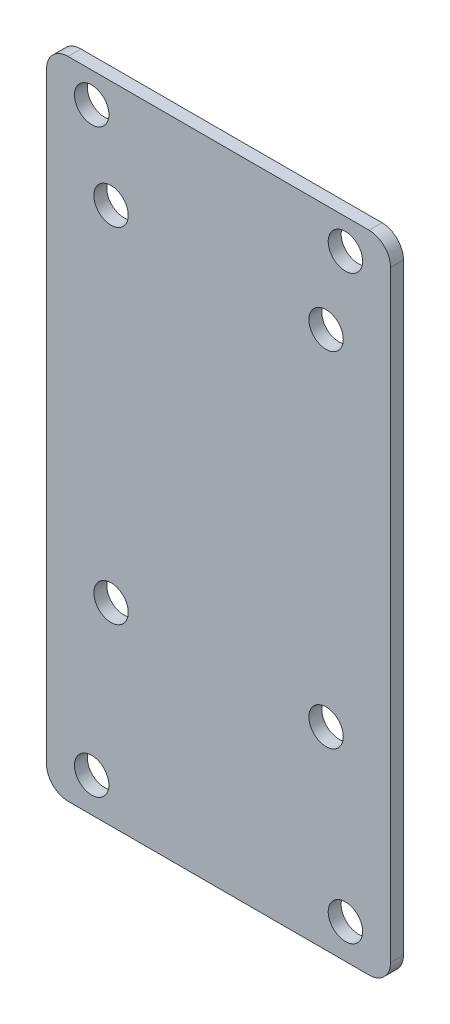
ISO-10303-21;
HEADER;
FILE_DESCRIPTION(('STEP AP214'),'2;1');
FILE_NAME('part.step','',(''),(''),'','','');
FILE_SCHEMA(('AUTOMOTIVE_DESIGN { 1 0 10303 214 1 1 1 1 }'));
ENDSEC;
DATA;
#1=APPLICATION_CONTEXT('core data for automotive mechanical design processes');
#2=APPLICATION_PROTOCOL_DEFINITION('international standard','automotive_design',2000,#1);
#3=PRODUCT_CONTEXT('',#1,'mechanical');
#4=PRODUCT('Part','Part','',(#3));
#5=PRODUCT_RELATED_PRODUCT_CATEGORY('part','',(#4));
#6=PRODUCT_DEFINITION_FORMATION('','',#4);
#7=PRODUCT_DEFINITION_CONTEXT('part definition',#1,'design');
#8=PRODUCT_DEFINITION('design','',#6,#7);
#9=PRODUCT_DEFINITION_SHAPE('','',#8);
#10=(LENGTH_UNIT() NAMED_UNIT(*) SI_UNIT(.MILLI.,.METRE.));
#11=(NAMED_UNIT(*) PLANE_ANGLE_UNIT() SI_UNIT($,.RADIAN.));
#12=(NAMED_UNIT(*) SI_UNIT($,.STERADIAN.) SOLID_ANGLE_UNIT());
#13=UNCERTAINTY_MEASURE_WITH_UNIT(LENGTH_MEASURE(1.E-05),#10,'distance_accuracy_value','');
#14=(GEOMETRIC_REPRESENTATION_CONTEXT(3) GLOBAL_UNCERTAINTY_ASSIGNED_CONTEXT((#13)) GLOBAL_UNIT_ASSIGNED_CONTEXT((#10,
#11,#12)) REPRESENTATION_CONTEXT('',''));
#15=CARTESIAN_POINT('',(0.,0.,0.));
#16=DIRECTION('',(0.,0.,1.));
#17=DIRECTION('',(1.,0.,0.));
#18=AXIS2_PLACEMENT_3D('',#15,#16,#17);
#19=CARTESIAN_POINT('',(0.,0.,3.));
#20=DIRECTION('',(0.,0.,1.));
#21=DIRECTION('',(1.,0.,0.));
#22=AXIS2_PLACEMENT_3D('',#19,#20,#21);
#23=PLANE('',#22);
#24=CARTESIAN_POINT('',(25.,-30.,3.));
#25=DIRECTION('',(0.,0.,1.));
#26=DIRECTION('',(1.,0.,0.));
#27=AXIS2_PLACEMENT_3D('',#24,#25,#26);
#28=CIRCLE('',#27,3.99999999999999);
#29=CARTESIAN_POINT('',(29.,-30.,3.));
#30=VERTEX_POINT('',#29);
#31=EDGE_CURVE('E210',#30,#30,#28,.T.);
#32=ORIENTED_EDGE('',*,*,#31,.F.);
#33=EDGE_LOOP('',(#32));
#34=FACE_BOUND('',#33,.T.);
#35=CARTESIAN_POINT('',(-25.,50.,3.));
#36=DIRECTION('',(0.,0.,1.));
#37=DIRECTION('',(1.,0.,0.));
#38=AXIS2_PLACEMENT_3D('',#35,#36,#37);
#39=CIRCLE('',#38,4.);
#40=CARTESIAN_POINT('',(-21.,50.,3.));
#41=VERTEX_POINT('',#40);
#42=EDGE_CURVE('E198',#41,#41,#39,.T.);
#43=ORIENTED_EDGE('',*,*,#42,.F.);
#44=EDGE_LOOP('',(#43));
#45=FACE_BOUND('',#44,.T.);
#46=CARTESIAN_POINT('',(29.5,-67.,3.));
#47=DIRECTION('',(0.,0.,1.));
#48=DIRECTION('',(1.,0.,0.));
#49=AXIS2_PLACEMENT_3D('',#46,#47,#48);
#50=CIRCLE('',#49,4.00000000000002);
#51=CARTESIAN_POINT('',(33.5,-67.,3.));
#52=VERTEX_POINT('',#51);
#53=EDGE_CURVE('E186',#52,#52,#50,.T.);
#54=ORIENTED_EDGE('',*,*,#53,.F.);
#55=EDGE_LOOP('',(#54));
#56=FACE_BOUND('',#55,.T.);
#57=CARTESIAN_POINT('',(-29.5,68.,3.));
#58=DIRECTION('',(0.,0.,1.));
#59=DIRECTION('',(1.,0.,0.));
#60=AXIS2_PLACEMENT_3D('',#57,#58,#59);
#61=CIRCLE('',#60,4.);
#62=CARTESIAN_POINT('',(-25.5,68.,3.));
#63=VERTEX_POINT('',#62);
#64=EDGE_CURVE('E128',#63,#63,#61,.T.);
#65=ORIENTED_EDGE('',*,*,#64,.F.);
#66=EDGE_LOOP('',(#65));
#67=FACE_BOUND('',#66,.T.);
#68=DIRECTION('',(1.,0.,0.));
#69=VECTOR('',#68,1.);
#70=CARTESIAN_POINT('',(-40.,-75.,3.));
#71=LINE('',#70,#69);
#72=CARTESIAN_POINT('',(-35.,-75.,3.));
#73=VERTEX_POINT('',#72);
#74=CARTESIAN_POINT('',(35.,-75.,3.));
#75=VERTEX_POINT('',#74);
#76=EDGE_CURVE('E137',#73,#75,#71,.T.);
#77=ORIENTED_EDGE('',*,*,#76,.T.);
#78=CARTESIAN_POINT('',(35.,-70.,3.));
#79=DIRECTION('',(0.,0.,1.));
#80=DIRECTION('',(1.,0.,0.));
#81=AXIS2_PLACEMENT_3D('',#78,#79,#80);
#82=CIRCLE('',#81,5.);
#83=CARTESIAN_POINT('',(40.,-70.,3.));
#84=VERTEX_POINT('',#83);
#85=EDGE_CURVE('E155',#75,#84,#82,.T.);
#86=ORIENTED_EDGE('',*,*,#85,.T.);
#87=DIRECTION('',(0.,1.,0.));
#88=VECTOR('',#87,1.);
#89=CARTESIAN_POINT('',(40.,75.,3.));
#90=LINE('',#89,#88);
#91=CARTESIAN_POINT('',(40.,70.,3.));
#92=VERTEX_POINT('',#91);
#93=EDGE_CURVE('E119',#84,#92,#90,.T.);
#94=ORIENTED_EDGE('',*,*,#93,.T.);
#95=CARTESIAN_POINT('',(35.,70.,3.));
#96=DIRECTION('',(0.,0.,1.));
#97=DIRECTION('',(1.,0.,0.));
#98=AXIS2_PLACEMENT_3D('',#95,#96,#97);
#99=CIRCLE('',#98,5.);
#100=CARTESIAN_POINT('',(35.,75.,3.));
#101=VERTEX_POINT('',#100);
#102=EDGE_CURVE('E152',#92,#101,#99,.T.);
#103=ORIENTED_EDGE('',*,*,#102,.T.);
#104=DIRECTION('',(-1.,0.,0.));
#105=VECTOR('',#104,1.);
#106=CARTESIAN_POINT('',(-40.,75.,3.));
#107=LINE('',#106,#105);
#108=CARTESIAN_POINT('',(-35.,75.,3.));
#109=VERTEX_POINT('',#108);
#110=EDGE_CURVE('E166',#101,#109,#107,.T.);
#111=ORIENTED_EDGE('',*,*,#110,.T.);
#112=CARTESIAN_POINT('',(-35.,70.,3.));
#113=DIRECTION('',(0.,0.,1.));
#114=DIRECTION('',(1.,0.,0.));
#115=AXIS2_PLACEMENT_3D('',#112,#113,#114);
#116=CIRCLE('',#115,5.);
#117=CARTESIAN_POINT('',(-40.,70.,3.));
#118=VERTEX_POINT('',#117);
#119=EDGE_CURVE('E55',#109,#118,#116,.T.);
#120=ORIENTED_EDGE('',*,*,#119,.T.);
#121=DIRECTION('',(0.,-1.,0.));
#122=VECTOR('',#121,1.);
#123=CARTESIAN_POINT('',(-40.,75.,3.));
#124=LINE('',#123,#122);
#125=CARTESIAN_POINT('',(-40.,-70.,3.));
#126=VERTEX_POINT('',#125);
#127=EDGE_CURVE('E174',#118,#126,#124,.T.);
#128=ORIENTED_EDGE('',*,*,#127,.T.);
#129=CARTESIAN_POINT('',(-35.,-70.,3.));
#130=DIRECTION('',(0.,0.,1.));
#131=DIRECTION('',(1.,0.,0.));
#132=AXIS2_PLACEMENT_3D('',#129,#130,#131);
#133=CIRCLE('',#132,5.);
#134=EDGE_CURVE('E150',#126,#73,#133,.T.);
#135=ORIENTED_EDGE('',*,*,#134,.T.);
#136=EDGE_LOOP('',(#77,#86,#94,#103,#111,#120,#128,#135));
#137=FACE_BOUND('',#136,.T.);
#138=CARTESIAN_POINT('',(29.5,68.0000000000001,3.));
#139=DIRECTION('',(0.,0.,1.));
#140=DIRECTION('',(1.,0.,0.));
#141=AXIS2_PLACEMENT_3D('',#138,#139,#140);
#142=CIRCLE('',#141,3.99999999999998);
#143=CARTESIAN_POINT('',(33.5,68.0000000000001,3.));
#144=VERTEX_POINT('',#143);
#145=EDGE_CURVE('E181',#144,#144,#142,.T.);
#146=ORIENTED_EDGE('',*,*,#145,.F.);
#147=EDGE_LOOP('',(#146));
#148=FACE_BOUND('',#147,.T.);
#149=CARTESIAN_POINT('',(-29.5,-67.,3.));
#150=DIRECTION('',(0.,0.,1.));
#151=DIRECTION('',(1.,0.,0.));
#152=AXIS2_PLACEMENT_3D('',#149,#150,#151);
#153=CIRCLE('',#152,4.);
#154=CARTESIAN_POINT('',(-25.5,-67.,3.));
#155=VERTEX_POINT('',#154);
#156=EDGE_CURVE('E192',#155,#155,#153,.T.);
#157=ORIENTED_EDGE('',*,*,#156,.F.);
#158=EDGE_LOOP('',(#157));
#159=FACE_BOUND('',#158,.T.);
#160=CARTESIAN_POINT('',(25.,50.,3.));
#161=DIRECTION('',(0.,0.,1.));
#162=DIRECTION('',(1.,0.,0.));
#163=AXIS2_PLACEMENT_3D('',#160,#161,#162);
#164=CIRCLE('',#163,4.00000000000001);
#165=CARTESIAN_POINT('',(29.,50.,3.));
#166=VERTEX_POINT('',#165);
#167=EDGE_CURVE('E204',#166,#166,#164,.T.);
#168=ORIENTED_EDGE('',*,*,#167,.F.);
#169=EDGE_LOOP('',(#168));
#170=FACE_BOUND('',#169,.T.);
#171=CARTESIAN_POINT('',(-25.,-30.,3.));
#172=DIRECTION('',(0.,0.,1.));
#173=DIRECTION('',(1.,0.,0.));
#174=AXIS2_PLACEMENT_3D('',#171,#172,#173);
#175=CIRCLE('',#174,4.);
#176=CARTESIAN_POINT('',(-21.,-30.,3.));
#177=VERTEX_POINT('',#176);
#178=EDGE_CURVE('E216',#177,#177,#175,.T.);
#179=ORIENTED_EDGE('',*,*,#178,.F.);
#180=EDGE_LOOP('',(#179));
#181=FACE_BOUND('',#180,.T.);
#182=ADVANCED_FACE('F33',(#34,#45,#56,#67,#137,#148,#159,#170,#181),#23,.T.);
#183=CARTESIAN_POINT('',(0.,0.,0.));
#184=DIRECTION('',(0.,0.,1.));
#185=DIRECTION('',(1.,0.,0.));
#186=AXIS2_PLACEMENT_3D('',#183,#184,#185);
#187=PLANE('',#186);
#188=DIRECTION('',(0.,1.,0.));
#189=VECTOR('',#188,1.);
#190=CARTESIAN_POINT('',(40.,75.,0.));
#191=LINE('',#190,#189);
#192=CARTESIAN_POINT('',(40.,-70.,0.));
#193=VERTEX_POINT('',#192);
#194=CARTESIAN_POINT('',(40.,70.,0.));
#195=VERTEX_POINT('',#194);
#196=EDGE_CURVE('E116',#193,#195,#191,.T.);
#197=ORIENTED_EDGE('',*,*,#196,.F.);
#198=CARTESIAN_POINT('',(35.,-70.,0.));
#199=DIRECTION('',(0.,0.,1.));
#200=DIRECTION('',(1.,0.,0.));
#201=AXIS2_PLACEMENT_3D('',#198,#199,#200);
#202=CIRCLE('',#201,5.);
#203=CARTESIAN_POINT('',(35.,-75.,0.));
#204=VERTEX_POINT('',#203);
#205=EDGE_CURVE('E99',#193,#204,#202,.F.);
#206=ORIENTED_EDGE('',*,*,#205,.T.);
#207=DIRECTION('',(1.,0.,0.));
#208=VECTOR('',#207,1.);
#209=CARTESIAN_POINT('',(-40.,-75.,0.));
#210=LINE('',#209,#208);
#211=CARTESIAN_POINT('',(-35.,-75.,0.));
#212=VERTEX_POINT('',#211);
#213=EDGE_CURVE('E141',#212,#204,#210,.T.);
#214=ORIENTED_EDGE('',*,*,#213,.F.);
#215=CARTESIAN_POINT('',(-35.,-70.,0.));
#216=DIRECTION('',(0.,0.,1.));
#217=DIRECTION('',(1.,0.,0.));
#218=AXIS2_PLACEMENT_3D('',#215,#216,#217);
#219=CIRCLE('',#218,5.);
#220=CARTESIAN_POINT('',(-40.,-70.,0.));
#221=VERTEX_POINT('',#220);
#222=EDGE_CURVE('E120',#212,#221,#219,.F.);
#223=ORIENTED_EDGE('',*,*,#222,.T.);
#224=DIRECTION('',(0.,-1.,0.));
#225=VECTOR('',#224,1.);
#226=CARTESIAN_POINT('',(-40.,75.,0.));
#227=LINE('',#226,#225);
#228=CARTESIAN_POINT('',(-40.,70.,0.));
#229=VERTEX_POINT('',#228);
#230=EDGE_CURVE('E131',#229,#221,#227,.T.);
#231=ORIENTED_EDGE('',*,*,#230,.F.);
#232=CARTESIAN_POINT('',(-35.,70.,0.));
#233=DIRECTION('',(0.,0.,1.));
#234=DIRECTION('',(1.,0.,0.));
#235=AXIS2_PLACEMENT_3D('',#232,#233,#234);
#236=CIRCLE('',#235,5.);
#237=CARTESIAN_POINT('',(-35.,75.,0.));
#238=VERTEX_POINT('',#237);
#239=EDGE_CURVE('E110',#229,#238,#236,.F.);
#240=ORIENTED_EDGE('',*,*,#239,.T.);
#241=DIRECTION('',(-1.,0.,0.));
#242=VECTOR('',#241,1.);
#243=CARTESIAN_POINT('',(-40.,75.,0.));
#244=LINE('',#243,#242);
#245=CARTESIAN_POINT('',(35.,75.,0.));
#246=VERTEX_POINT('',#245);
#247=EDGE_CURVE('E127',#246,#238,#244,.T.);
#248=ORIENTED_EDGE('',*,*,#247,.F.);
#249=CARTESIAN_POINT('',(35.,70.,0.));
#250=DIRECTION('',(0.,0.,1.));
#251=DIRECTION('',(1.,0.,0.));
#252=AXIS2_PLACEMENT_3D('',#249,#250,#251);
#253=CIRCLE('',#252,5.);
#254=EDGE_CURVE('E126',#246,#195,#253,.F.);
#255=ORIENTED_EDGE('',*,*,#254,.T.);
#256=EDGE_LOOP('',(#197,#206,#214,#223,#231,#240,#248,#255));
#257=FACE_BOUND('',#256,.T.);
#258=CARTESIAN_POINT('',(-29.5,68.,0.));
#259=DIRECTION('',(0.,0.,1.));
#260=DIRECTION('',(1.,0.,0.));
#261=AXIS2_PLACEMENT_3D('',#258,#259,#260);
#262=CIRCLE('',#261,4.);
#263=CARTESIAN_POINT('',(-25.5,68.,0.));
#264=VERTEX_POINT('',#263);
#265=EDGE_CURVE('E134',#264,#264,#262,.T.);
#266=ORIENTED_EDGE('',*,*,#265,.T.);
#267=EDGE_LOOP('',(#266));
#268=FACE_BOUND('',#267,.T.);
#269=CARTESIAN_POINT('',(29.5,68.0000000000001,0.));
#270=DIRECTION('',(0.,0.,1.));
#271=DIRECTION('',(1.,0.,0.));
#272=AXIS2_PLACEMENT_3D('',#269,#270,#271);
#273=CIRCLE('',#272,3.99999999999998);
#274=CARTESIAN_POINT('',(33.5,68.0000000000001,0.));
#275=VERTEX_POINT('',#274);
#276=EDGE_CURVE('E183',#275,#275,#273,.T.);
#277=ORIENTED_EDGE('',*,*,#276,.T.);
#278=EDGE_LOOP('',(#277));
#279=FACE_BOUND('',#278,.T.);
#280=CARTESIAN_POINT('',(29.5,-67.,0.));
#281=DIRECTION('',(0.,0.,1.));
#282=DIRECTION('',(1.,0.,0.));
#283=AXIS2_PLACEMENT_3D('',#280,#281,#282);
#284=CIRCLE('',#283,4.00000000000002);
#285=CARTESIAN_POINT('',(33.5,-67.,0.));
#286=VERTEX_POINT('',#285);
#287=EDGE_CURVE('E189',#286,#286,#284,.T.);
#288=ORIENTED_EDGE('',*,*,#287,.T.);
#289=EDGE_LOOP('',(#288));
#290=FACE_BOUND('',#289,.T.);
#291=CARTESIAN_POINT('',(-29.5,-67.,0.));
#292=DIRECTION('',(0.,0.,1.));
#293=DIRECTION('',(1.,0.,0.));
#294=AXIS2_PLACEMENT_3D('',#291,#292,#293);
#295=CIRCLE('',#294,4.);
#296=CARTESIAN_POINT('',(-25.5,-67.,0.));
#297=VERTEX_POINT('',#296);
#298=EDGE_CURVE('E195',#297,#297,#295,.T.);
#299=ORIENTED_EDGE('',*,*,#298,.T.);
#300=EDGE_LOOP('',(#299));
#301=FACE_BOUND('',#300,.T.);
#302=CARTESIAN_POINT('',(-25.,50.,0.));
#303=DIRECTION('',(0.,0.,1.));
#304=DIRECTION('',(1.,0.,0.));
#305=AXIS2_PLACEMENT_3D('',#302,#303,#304);
#306=CIRCLE('',#305,4.);
#307=CARTESIAN_POINT('',(-21.,50.,0.));
#308=VERTEX_POINT('',#307);
#309=EDGE_CURVE('E201',#308,#308,#306,.T.);
#310=ORIENTED_EDGE('',*,*,#309,.T.);
#311=EDGE_LOOP('',(#310));
#312=FACE_BOUND('',#311,.T.);
#313=CARTESIAN_POINT('',(25.,50.,0.));
#314=DIRECTION('',(0.,0.,1.));
#315=DIRECTION('',(1.,0.,0.));
#316=AXIS2_PLACEMENT_3D('',#313,#314,#315);
#317=CIRCLE('',#316,4.00000000000001);
#318=CARTESIAN_POINT('',(29.,50.,0.));
#319=VERTEX_POINT('',#318);
#320=EDGE_CURVE('E207',#319,#319,#317,.T.);
#321=ORIENTED_EDGE('',*,*,#320,.T.);
#322=EDGE_LOOP('',(#321));
#323=FACE_BOUND('',#322,.T.);
#324=CARTESIAN_POINT('',(25.,-30.,0.));
#325=DIRECTION('',(0.,0.,1.));
#326=DIRECTION('',(1.,0.,0.));
#327=AXIS2_PLACEMENT_3D('',#324,#325,#326);
#328=CIRCLE('',#327,3.99999999999999);
#329=CARTESIAN_POINT('',(29.,-30.,0.));
#330=VERTEX_POINT('',#329);
#331=EDGE_CURVE('E213',#330,#330,#328,.T.);
#332=ORIENTED_EDGE('',*,*,#331,.T.);
#333=EDGE_LOOP('',(#332));
#334=FACE_BOUND('',#333,.T.);
#335=CARTESIAN_POINT('',(-25.,-30.,0.));
#336=DIRECTION('',(0.,0.,1.));
#337=DIRECTION('',(1.,0.,0.));
#338=AXIS2_PLACEMENT_3D('',#335,#336,#337);
#339=CIRCLE('',#338,4.);
#340=CARTESIAN_POINT('',(-21.,-30.,0.));
#341=VERTEX_POINT('',#340);
#342=EDGE_CURVE('E219',#341,#341,#339,.T.);
#343=ORIENTED_EDGE('',*,*,#342,.T.);
#344=EDGE_LOOP('',(#343));
#345=FACE_BOUND('',#344,.T.);
#346=ADVANCED_FACE('F123',(#257,#268,#279,#290,#301,#312,#323,#334,#345),#187,.F.);
#347=CARTESIAN_POINT('',(40.,75.,3.));
#348=DIRECTION('',(-1.,0.,0.));
#349=DIRECTION('',(0.,-1.,0.));
#350=AXIS2_PLACEMENT_3D('',#347,#348,#349);
#351=PLANE('',#350);
#352=ORIENTED_EDGE('',*,*,#93,.F.);
#353=DIRECTION('',(0.,0.,-1.));
#354=VECTOR('',#353,1.);
#355=CARTESIAN_POINT('',(40.,-70.,3.));
#356=LINE('',#355,#354);
#357=EDGE_CURVE('E103',#84,#193,#356,.T.);
#358=ORIENTED_EDGE('',*,*,#357,.T.);
#359=ORIENTED_EDGE('',*,*,#196,.T.);
#360=DIRECTION('',(0.,0.,-1.));
#361=VECTOR('',#360,1.);
#362=CARTESIAN_POINT('',(40.,70.,3.));
#363=LINE('',#362,#361);
#364=EDGE_CURVE('E121',#195,#92,#363,.F.);
#365=ORIENTED_EDGE('',*,*,#364,.T.);
#366=EDGE_LOOP('',(#352,#358,#359,#365));
#367=FACE_BOUND('',#366,.T.);
#368=ADVANCED_FACE('F115',(#367),#351,.F.);
#369=CARTESIAN_POINT('',(-40.,75.,3.));
#370=DIRECTION('',(0.,-1.,0.));
#371=DIRECTION('',(0.,0.,-1.));
#372=AXIS2_PLACEMENT_3D('',#369,#370,#371);
#373=PLANE('',#372);
#374=ORIENTED_EDGE('',*,*,#247,.T.);
#375=DIRECTION('',(0.,0.,-1.));
#376=VECTOR('',#375,1.);
#377=CARTESIAN_POINT('',(-35.,75.,3.));
#378=LINE('',#377,#376);
#379=EDGE_CURVE('E11',#238,#109,#378,.F.);
#380=ORIENTED_EDGE('',*,*,#379,.T.);
#381=ORIENTED_EDGE('',*,*,#110,.F.);
#382=DIRECTION('',(0.,0.,-1.));
#383=VECTOR('',#382,1.);
#384=CARTESIAN_POINT('',(35.,75.,3.));
#385=LINE('',#384,#383);
#386=EDGE_CURVE('E41',#101,#246,#385,.T.);
#387=ORIENTED_EDGE('',*,*,#386,.T.);
#388=EDGE_LOOP('',(#374,#380,#381,#387));
#389=FACE_BOUND('',#388,.T.);
#390=ADVANCED_FACE('F164',(#389),#373,.F.);
#391=CARTESIAN_POINT('',(-40.,75.,3.));
#392=DIRECTION('',(1.,0.,0.));
#393=DIRECTION('',(0.,1.,0.));
#394=AXIS2_PLACEMENT_3D('',#391,#392,#393);
#395=PLANE('',#394);
#396=ORIENTED_EDGE('',*,*,#127,.F.);
#397=DIRECTION('',(0.,0.,-1.));
#398=VECTOR('',#397,1.);
#399=CARTESIAN_POINT('',(-40.,70.,3.));
#400=LINE('',#399,#398);
#401=EDGE_CURVE('E158',#118,#229,#400,.T.);
#402=ORIENTED_EDGE('',*,*,#401,.T.);
#403=ORIENTED_EDGE('',*,*,#230,.T.);
#404=DIRECTION('',(0.,0.,-1.));
#405=VECTOR('',#404,1.);
#406=CARTESIAN_POINT('',(-40.,-70.,3.));
#407=LINE('',#406,#405);
#408=EDGE_CURVE('E48',#221,#126,#407,.F.);
#409=ORIENTED_EDGE('',*,*,#408,.T.);
#410=EDGE_LOOP('',(#396,#402,#403,#409));
#411=FACE_BOUND('',#410,.T.);
#412=ADVANCED_FACE('F173',(#411),#395,.F.);
#413=CARTESIAN_POINT('',(-40.,-75.,3.));
#414=DIRECTION('',(0.,1.,0.));
#415=DIRECTION('',(0.,0.,1.));
#416=AXIS2_PLACEMENT_3D('',#413,#414,#415);
#417=PLANE('',#416);
#418=ORIENTED_EDGE('',*,*,#213,.T.);
#419=DIRECTION('',(0.,0.,-1.));
#420=VECTOR('',#419,1.);
#421=CARTESIAN_POINT('',(35.,-75.,3.));
#422=LINE('',#421,#420);
#423=EDGE_CURVE('E104',#204,#75,#422,.F.);
#424=ORIENTED_EDGE('',*,*,#423,.T.);
#425=ORIENTED_EDGE('',*,*,#76,.F.);
#426=DIRECTION('',(0.,0.,-1.));
#427=VECTOR('',#426,1.);
#428=CARTESIAN_POINT('',(-35.,-75.,3.));
#429=LINE('',#428,#427);
#430=EDGE_CURVE('E109',#73,#212,#429,.T.);
#431=ORIENTED_EDGE('',*,*,#430,.T.);
#432=EDGE_LOOP('',(#418,#424,#425,#431));
#433=FACE_BOUND('',#432,.T.);
#434=ADVANCED_FACE('F241',(#433),#417,.F.);
#435=CARTESIAN_POINT('',(-29.5,68.,3.));
#436=DIRECTION('',(0.,0.,-1.));
#437=DIRECTION('',(-1.,0.,0.));
#438=AXIS2_PLACEMENT_3D('',#435,#436,#437);
#439=CYLINDRICAL_SURFACE('',#438,4.);
#440=ORIENTED_EDGE('',*,*,#64,.T.);
#441=EDGE_LOOP('',(#440));
#442=FACE_BOUND('',#441,.T.);
#443=ORIENTED_EDGE('',*,*,#265,.F.);
#444=EDGE_LOOP('',(#443));
#445=FACE_BOUND('',#444,.T.);
#446=ADVANCED_FACE('F238',(#442,#445),#439,.F.);
#447=CARTESIAN_POINT('',(29.5,68.0000000000001,3.));
#448=DIRECTION('',(0.,0.,-1.));
#449=DIRECTION('',(-1.,0.,0.));
#450=AXIS2_PLACEMENT_3D('',#447,#448,#449);
#451=CYLINDRICAL_SURFACE('',#450,3.99999999999998);
#452=ORIENTED_EDGE('',*,*,#145,.T.);
#453=EDGE_LOOP('',(#452));
#454=FACE_BOUND('',#453,.T.);
#455=ORIENTED_EDGE('',*,*,#276,.F.);
#456=EDGE_LOOP('',(#455));
#457=FACE_BOUND('',#456,.T.);
#458=ADVANCED_FACE('F298',(#454,#457),#451,.F.);
#459=CARTESIAN_POINT('',(29.5,-67.,3.));
#460=DIRECTION('',(0.,0.,-1.));
#461=DIRECTION('',(-1.,0.,0.));
#462=AXIS2_PLACEMENT_3D('',#459,#460,#461);
#463=CYLINDRICAL_SURFACE('',#462,4.00000000000002);
#464=ORIENTED_EDGE('',*,*,#53,.T.);
#465=EDGE_LOOP('',(#464));
#466=FACE_BOUND('',#465,.T.);
#467=ORIENTED_EDGE('',*,*,#287,.F.);
#468=EDGE_LOOP('',(#467));
#469=FACE_BOUND('',#468,.T.);
#470=ADVANCED_FACE('F295',(#466,#469),#463,.F.);
#471=CARTESIAN_POINT('',(-29.5,-67.,3.));
#472=DIRECTION('',(0.,0.,-1.));
#473=DIRECTION('',(-1.,0.,0.));
#474=AXIS2_PLACEMENT_3D('',#471,#472,#473);
#475=CYLINDRICAL_SURFACE('',#474,4.);
#476=ORIENTED_EDGE('',*,*,#156,.T.);
#477=EDGE_LOOP('',(#476));
#478=FACE_BOUND('',#477,.T.);
#479=ORIENTED_EDGE('',*,*,#298,.F.);
#480=EDGE_LOOP('',(#479));
#481=FACE_BOUND('',#480,.T.);
#482=ADVANCED_FACE('F291',(#478,#481),#475,.F.);
#483=CARTESIAN_POINT('',(-25.,50.,3.));
#484=DIRECTION('',(0.,0.,-1.));
#485=DIRECTION('',(-1.,0.,0.));
#486=AXIS2_PLACEMENT_3D('',#483,#484,#485);
#487=CYLINDRICAL_SURFACE('',#486,4.);
#488=ORIENTED_EDGE('',*,*,#42,.T.);
#489=EDGE_LOOP('',(#488));
#490=FACE_BOUND('',#489,.T.);
#491=ORIENTED_EDGE('',*,*,#309,.F.);
#492=EDGE_LOOP('',(#491));
#493=FACE_BOUND('',#492,.T.);
#494=ADVANCED_FACE('F273',(#490,#493),#487,.F.);
#495=CARTESIAN_POINT('',(25.,50.,3.));
#496=DIRECTION('',(0.,0.,-1.));
#497=DIRECTION('',(-1.,0.,0.));
#498=AXIS2_PLACEMENT_3D('',#495,#496,#497);
#499=CYLINDRICAL_SURFACE('',#498,4.00000000000001);
#500=ORIENTED_EDGE('',*,*,#167,.T.);
#501=EDGE_LOOP('',(#500));
#502=FACE_BOUND('',#501,.T.);
#503=ORIENTED_EDGE('',*,*,#320,.F.);
#504=EDGE_LOOP('',(#503));
#505=FACE_BOUND('',#504,.T.);
#506=ADVANCED_FACE('F269',(#502,#505),#499,.F.);
#507=CARTESIAN_POINT('',(25.,-30.,3.));
#508=DIRECTION('',(0.,0.,-1.));
#509=DIRECTION('',(-1.,0.,0.));
#510=AXIS2_PLACEMENT_3D('',#507,#508,#509);
#511=CYLINDRICAL_SURFACE('',#510,3.99999999999999);
#512=ORIENTED_EDGE('',*,*,#31,.T.);
#513=EDGE_LOOP('',(#512));
#514=FACE_BOUND('',#513,.T.);
#515=ORIENTED_EDGE('',*,*,#331,.F.);
#516=EDGE_LOOP('',(#515));
#517=FACE_BOUND('',#516,.T.);
#518=ADVANCED_FACE('F272',(#514,#517),#511,.F.);
#519=CARTESIAN_POINT('',(-25.,-30.,3.));
#520=DIRECTION('',(0.,0.,-1.));
#521=DIRECTION('',(-1.,0.,0.));
#522=AXIS2_PLACEMENT_3D('',#519,#520,#521);
#523=CYLINDRICAL_SURFACE('',#522,4.);
#524=ORIENTED_EDGE('',*,*,#178,.T.);
#525=EDGE_LOOP('',(#524));
#526=FACE_BOUND('',#525,.T.);
#527=ORIENTED_EDGE('',*,*,#342,.F.);
#528=EDGE_LOOP('',(#527));
#529=FACE_BOUND('',#528,.T.);
#530=ADVANCED_FACE('F225',(#526,#529),#523,.F.);
#531=CARTESIAN_POINT('',(35.,-70.,3.));
#532=DIRECTION('',(0.,0.,-1.));
#533=DIRECTION('',(-1.,0.,0.));
#534=AXIS2_PLACEMENT_3D('',#531,#532,#533);
#535=CYLINDRICAL_SURFACE('',#534,5.);
#536=ORIENTED_EDGE('',*,*,#85,.F.);
#537=ORIENTED_EDGE('',*,*,#423,.F.);
#538=ORIENTED_EDGE('',*,*,#205,.F.);
#539=ORIENTED_EDGE('',*,*,#357,.F.);
#540=EDGE_LOOP('',(#536,#537,#538,#539));
#541=FACE_BOUND('',#540,.T.);
#542=ADVANCED_FACE('F102',(#541),#535,.T.);
#543=CARTESIAN_POINT('',(-35.,70.,3.));
#544=DIRECTION('',(0.,0.,-1.));
#545=DIRECTION('',(-1.,0.,0.));
#546=AXIS2_PLACEMENT_3D('',#543,#544,#545);
#547=CYLINDRICAL_SURFACE('',#546,5.);
#548=ORIENTED_EDGE('',*,*,#119,.F.);
#549=ORIENTED_EDGE('',*,*,#379,.F.);
#550=ORIENTED_EDGE('',*,*,#239,.F.);
#551=ORIENTED_EDGE('',*,*,#401,.F.);
#552=EDGE_LOOP('',(#548,#549,#550,#551));
#553=FACE_BOUND('',#552,.T.);
#554=ADVANCED_FACE('F172',(#553),#547,.T.);
#555=CARTESIAN_POINT('',(35.,70.,3.));
#556=DIRECTION('',(0.,0.,-1.));
#557=DIRECTION('',(-1.,0.,0.));
#558=AXIS2_PLACEMENT_3D('',#555,#556,#557);
#559=CYLINDRICAL_SURFACE('',#558,5.);
#560=ORIENTED_EDGE('',*,*,#102,.F.);
#561=ORIENTED_EDGE('',*,*,#364,.F.);
#562=ORIENTED_EDGE('',*,*,#254,.F.);
#563=ORIENTED_EDGE('',*,*,#386,.F.);
#564=EDGE_LOOP('',(#560,#561,#562,#563));
#565=FACE_BOUND('',#564,.T.);
#566=ADVANCED_FACE('F254',(#565),#559,.T.);
#567=CARTESIAN_POINT('',(-35.,-70.,3.));
#568=DIRECTION('',(0.,0.,-1.));
#569=DIRECTION('',(-1.,0.,0.));
#570=AXIS2_PLACEMENT_3D('',#567,#568,#569);
#571=CYLINDRICAL_SURFACE('',#570,5.);
#572=ORIENTED_EDGE('',*,*,#134,.F.);
#573=ORIENTED_EDGE('',*,*,#408,.F.);
#574=ORIENTED_EDGE('',*,*,#222,.F.);
#575=ORIENTED_EDGE('',*,*,#430,.F.);
#576=EDGE_LOOP('',(#572,#573,#574,#575));
#577=FACE_BOUND('',#576,.T.);
#578=ADVANCED_FACE('F35',(#577),#571,.T.);
#579=CLOSED_SHELL('',(#182,#346,#368,#390,#412,#434,#446,#458,#470,#482,#494,#506,#518,#530,
#542,#554,#566,#578));
#580=MANIFOLD_SOLID_BREP('B2',#579);
#581=ADVANCED_BREP_SHAPE_REPRESENTATION('',(#18,#580),#14);
#582=SHAPE_DEFINITION_REPRESENTATION(#9,#581);
ENDSEC;
END-ISO-10303-21;
